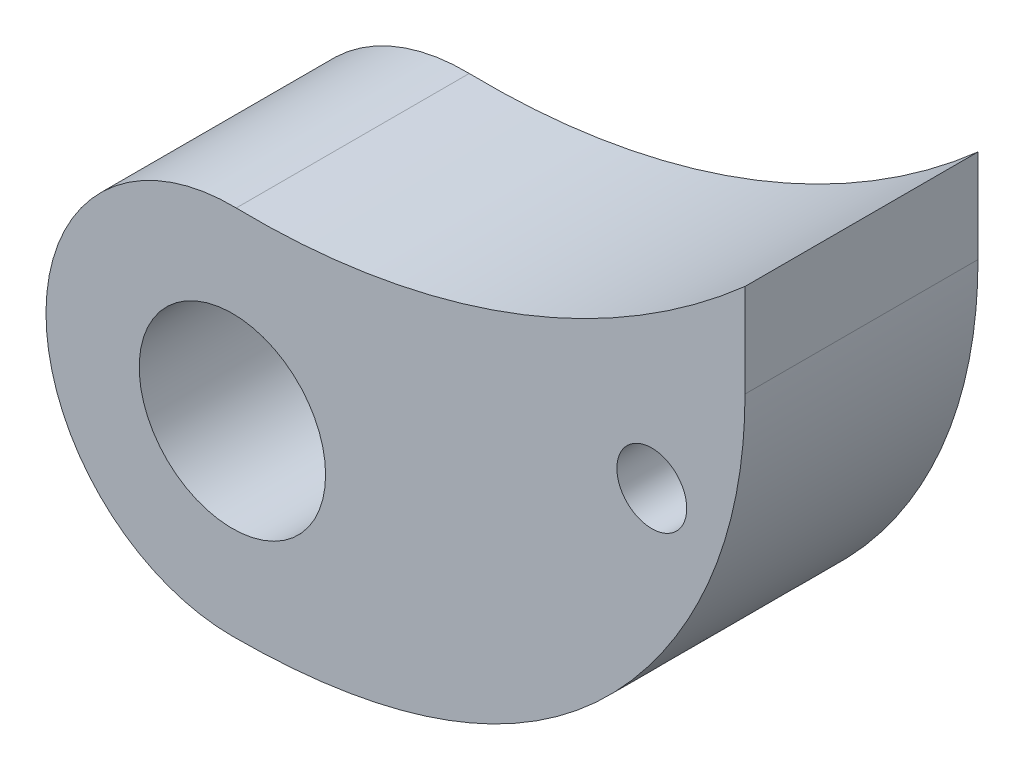
ISO-10303-21;
HEADER;
FILE_DESCRIPTION(('STEP AP214'),'2;1');
FILE_NAME('part.step','',(''),(''),'','','');
FILE_SCHEMA(('AUTOMOTIVE_DESIGN { 1 0 10303 214 1 1 1 1 }'));
ENDSEC;
DATA;
#1=APPLICATION_CONTEXT('core data for automotive mechanical design processes');
#2=APPLICATION_PROTOCOL_DEFINITION('international standard','automotive_design',2000,#1);
#3=PRODUCT_CONTEXT('',#1,'mechanical');
#4=PRODUCT('Part','Part','',(#3));
#5=PRODUCT_RELATED_PRODUCT_CATEGORY('part','',(#4));
#6=PRODUCT_DEFINITION_FORMATION('','',#4);
#7=PRODUCT_DEFINITION_CONTEXT('part definition',#1,'design');
#8=PRODUCT_DEFINITION('design','',#6,#7);
#9=PRODUCT_DEFINITION_SHAPE('','',#8);
#10=(LENGTH_UNIT() NAMED_UNIT(*) SI_UNIT(.MILLI.,.METRE.));
#11=(NAMED_UNIT(*) PLANE_ANGLE_UNIT() SI_UNIT($,.RADIAN.));
#12=(NAMED_UNIT(*) SI_UNIT($,.STERADIAN.) SOLID_ANGLE_UNIT());
#13=UNCERTAINTY_MEASURE_WITH_UNIT(LENGTH_MEASURE(1.E-05),#10,'distance_accuracy_value','');
#14=(GEOMETRIC_REPRESENTATION_CONTEXT(3) GLOBAL_UNCERTAINTY_ASSIGNED_CONTEXT((#13)) GLOBAL_UNIT_ASSIGNED_CONTEXT((#10,
#11,#12)) REPRESENTATION_CONTEXT('',''));
#15=CARTESIAN_POINT('',(0.,0.,0.));
#16=DIRECTION('',(0.,0.,1.));
#17=DIRECTION('',(1.,0.,0.));
#18=AXIS2_PLACEMENT_3D('',#15,#16,#17);
#19=CARTESIAN_POINT('',(0.412180191892476,19.9957522361478,-5.));
#20=DIRECTION('',(0.,0.,-1.));
#21=DIRECTION('',(1.,0.,0.));
#22=AXIS2_PLACEMENT_3D('',#19,#20,#21);
#23=PLANE('',#22);
#24=CARTESIAN_POINT('',(0.,0.,-5.));
#25=DIRECTION('',(0.,0.,1.));
#26=DIRECTION('',(1.,0.,0.));
#27=AXIS2_PLACEMENT_3D('',#24,#25,#26);
#28=CIRCLE('',#27,2.);
#29=CARTESIAN_POINT('',(2.,0.,-5.));
#30=VERTEX_POINT('',#29);
#31=EDGE_CURVE('E147',#30,#30,#28,.T.);
#32=ORIENTED_EDGE('',*,*,#31,.T.);
#33=EDGE_LOOP('',(#32));
#34=FACE_BOUND('',#33,.T.);
#35=CARTESIAN_POINT('',(0.412180191892476,19.9957522361478,-5.));
#36=DIRECTION('',(0.,0.,-1.));
#37=DIRECTION('',(1.,0.,0.));
#38=AXIS2_PLACEMENT_3D('',#35,#36,#37);
#39=CIRCLE('',#38,16.);
#40=CARTESIAN_POINT('',(11.,8.,-5.));
#41=VERTEX_POINT('',#40);
#42=CARTESIAN_POINT('',(0.0824360383784953,3.99915044722957,-5.));
#43=VERTEX_POINT('',#42);
#44=EDGE_CURVE('E93',#41,#43,#39,.T.);
#45=ORIENTED_EDGE('',*,*,#44,.F.);
#46=DIRECTION('',(0.,1.,0.));
#47=VECTOR('',#46,1.);
#48=CARTESIAN_POINT('',(11.,8.,-5.));
#49=LINE('',#48,#47);
#50=CARTESIAN_POINT('',(11.,6.,-5.));
#51=VERTEX_POINT('',#50);
#52=EDGE_CURVE('E96',#51,#41,#49,.T.);
#53=ORIENTED_EDGE('',*,*,#52,.F.);
#54=CARTESIAN_POINT('',(0.,-4.,-5.));
#55=CARTESIAN_POINT('',(4.2020349893536,-4.,-5.));
#56=CARTESIAN_POINT('',(8.98329257181985,-1.55655756657849,-5.));
#57=CARTESIAN_POINT('',(11.,3.64860659413861,-5.));
#58=CARTESIAN_POINT('',(11.,6.,-5.));
#59=B_SPLINE_CURVE_WITH_KNOTS('',3,(#54,#55,#56,#57,#58),.UNSPECIFIED.,.F.,.F.,(4,1,4),(0.,
0.608953578779127,1.),.UNSPECIFIED.);
#60=CARTESIAN_POINT('',(0.,-4.,-5.));
#61=VERTEX_POINT('',#60);
#62=EDGE_CURVE('E84',#61,#51,#59,.T.);
#63=ORIENTED_EDGE('',*,*,#62,.F.);
#64=CARTESIAN_POINT('',(0.,0.,-5.));
#65=DIRECTION('',(0.,0.,1.));
#66=DIRECTION('',(1.,0.,0.));
#67=AXIS2_PLACEMENT_3D('',#64,#65,#66);
#68=CIRCLE('',#67,4.);
#69=EDGE_CURVE('E89',#43,#61,#68,.T.);
#70=ORIENTED_EDGE('',*,*,#69,.F.);
#71=EDGE_LOOP('',(#45,#53,#63,#70));
#72=FACE_BOUND('',#71,.T.);
#73=CARTESIAN_POINT('',(9.,3.24788813764988,-5.));
#74=DIRECTION('',(0.,0.,1.));
#75=DIRECTION('',(1.,0.,0.));
#76=AXIS2_PLACEMENT_3D('',#73,#74,#75);
#77=CIRCLE('',#76,0.750000000000002);
#78=CARTESIAN_POINT('',(9.75,3.24788813764988,-5.));
#79=VERTEX_POINT('',#78);
#80=EDGE_CURVE('E138',#79,#79,#77,.T.);
#81=ORIENTED_EDGE('',*,*,#80,.T.);
#82=EDGE_LOOP('',(#81));
#83=FACE_BOUND('',#82,.T.);
#84=ADVANCED_FACE('F37',(#34,#72,#83),#23,.T.);
#85=CARTESIAN_POINT('',(0.412180191892476,19.9957522361478,0.));
#86=DIRECTION('',(0.,0.,-1.));
#87=DIRECTION('',(1.,0.,0.));
#88=AXIS2_PLACEMENT_3D('',#85,#86,#87);
#89=PLANE('',#88);
#90=CARTESIAN_POINT('',(0.412180191892476,19.9957522361478,0.));
#91=DIRECTION('',(0.,0.,-1.));
#92=DIRECTION('',(1.,0.,0.));
#93=AXIS2_PLACEMENT_3D('',#90,#91,#92);
#94=CIRCLE('',#93,16.);
#95=CARTESIAN_POINT('',(11.,8.,0.));
#96=VERTEX_POINT('',#95);
#97=CARTESIAN_POINT('',(0.0824360383784953,3.99915044722957,0.));
#98=VERTEX_POINT('',#97);
#99=EDGE_CURVE('E149',#96,#98,#94,.T.);
#100=ORIENTED_EDGE('',*,*,#99,.T.);
#101=CARTESIAN_POINT('',(0.,0.,0.));
#102=DIRECTION('',(0.,0.,1.));
#103=DIRECTION('',(1.,0.,0.));
#104=AXIS2_PLACEMENT_3D('',#101,#102,#103);
#105=CIRCLE('',#104,4.);
#106=CARTESIAN_POINT('',(0.,-4.,0.));
#107=VERTEX_POINT('',#106);
#108=EDGE_CURVE('E154',#98,#107,#105,.T.);
#109=ORIENTED_EDGE('',*,*,#108,.T.);
#110=CARTESIAN_POINT('',(0.,-4.,0.));
#111=CARTESIAN_POINT('',(4.2020349893536,-4.,0.));
#112=CARTESIAN_POINT('',(8.98329257181985,-1.55655756657849,0.));
#113=CARTESIAN_POINT('',(11.,3.64860659413861,0.));
#114=CARTESIAN_POINT('',(11.,6.,0.));
#115=B_SPLINE_CURVE_WITH_KNOTS('',3,(#110,#111,#112,#113,#114),.UNSPECIFIED.,.F.,.F.,(4,1,4),
(0.,0.608953578779127,1.),.UNSPECIFIED.);
#116=CARTESIAN_POINT('',(11.,6.,0.));
#117=VERTEX_POINT('',#116);
#118=EDGE_CURVE('E87',#107,#117,#115,.T.);
#119=ORIENTED_EDGE('',*,*,#118,.T.);
#120=DIRECTION('',(0.,1.,0.));
#121=VECTOR('',#120,1.);
#122=CARTESIAN_POINT('',(11.,8.,0.));
#123=LINE('',#122,#121);
#124=EDGE_CURVE('E151',#117,#96,#123,.T.);
#125=ORIENTED_EDGE('',*,*,#124,.T.);
#126=EDGE_LOOP('',(#100,#109,#119,#125));
#127=FACE_BOUND('',#126,.T.);
#128=CARTESIAN_POINT('',(0.,0.,0.));
#129=DIRECTION('',(0.,0.,1.));
#130=DIRECTION('',(1.,0.,0.));
#131=AXIS2_PLACEMENT_3D('',#128,#129,#130);
#132=CIRCLE('',#131,2.);
#133=CARTESIAN_POINT('',(2.,0.,0.));
#134=VERTEX_POINT('',#133);
#135=EDGE_CURVE('E144',#134,#134,#132,.T.);
#136=ORIENTED_EDGE('',*,*,#135,.F.);
#137=EDGE_LOOP('',(#136));
#138=FACE_BOUND('',#137,.T.);
#139=CARTESIAN_POINT('',(9.,3.24788813764988,0.));
#140=DIRECTION('',(0.,0.,1.));
#141=DIRECTION('',(1.,0.,0.));
#142=AXIS2_PLACEMENT_3D('',#139,#140,#141);
#143=CIRCLE('',#142,0.750000000000002);
#144=CARTESIAN_POINT('',(9.75,3.24788813764988,0.));
#145=VERTEX_POINT('',#144);
#146=EDGE_CURVE('E141',#145,#145,#143,.T.);
#147=ORIENTED_EDGE('',*,*,#146,.F.);
#148=EDGE_LOOP('',(#147));
#149=FACE_BOUND('',#148,.T.);
#150=ADVANCED_FACE('F116',(#127,#138,#149),#89,.F.);
#151=CARTESIAN_POINT('',(0.412180191892476,19.9957522361478,-5.));
#152=DIRECTION('',(0.,0.,1.));
#153=DIRECTION('',(-1.,0.,0.));
#154=AXIS2_PLACEMENT_3D('',#151,#152,#153);
#155=CYLINDRICAL_SURFACE('',#154,16.);
#156=ORIENTED_EDGE('',*,*,#99,.F.);
#157=DIRECTION('',(0.,0.,1.));
#158=VECTOR('',#157,1.);
#159=CARTESIAN_POINT('',(11.,8.,-5.));
#160=LINE('',#159,#158);
#161=EDGE_CURVE('E54',#41,#96,#160,.T.);
#162=ORIENTED_EDGE('',*,*,#161,.F.);
#163=ORIENTED_EDGE('',*,*,#44,.T.);
#164=DIRECTION('',(0.,0.,1.));
#165=VECTOR('',#164,1.);
#166=CARTESIAN_POINT('',(0.0824360383784953,3.99915044722957,-5.));
#167=LINE('',#166,#165);
#168=EDGE_CURVE('E11',#43,#98,#167,.T.);
#169=ORIENTED_EDGE('',*,*,#168,.T.);
#170=EDGE_LOOP('',(#156,#162,#163,#169));
#171=FACE_BOUND('',#170,.T.);
#172=ADVANCED_FACE('F39',(#171),#155,.F.);
#173=CARTESIAN_POINT('',(0.,0.,-5.));
#174=DIRECTION('',(0.,0.,1.));
#175=DIRECTION('',(-1.,0.,0.));
#176=AXIS2_PLACEMENT_3D('',#173,#174,#175);
#177=CYLINDRICAL_SURFACE('',#176,4.);
#178=ORIENTED_EDGE('',*,*,#108,.F.);
#179=ORIENTED_EDGE('',*,*,#168,.F.);
#180=ORIENTED_EDGE('',*,*,#69,.T.);
#181=DIRECTION('',(0.,0.,1.));
#182=VECTOR('',#181,1.);
#183=CARTESIAN_POINT('',(0.,-4.,-5.));
#184=LINE('',#183,#182);
#185=EDGE_CURVE('E46',#61,#107,#184,.T.);
#186=ORIENTED_EDGE('',*,*,#185,.T.);
#187=EDGE_LOOP('',(#178,#179,#180,#186));
#188=FACE_BOUND('',#187,.T.);
#189=ADVANCED_FACE('F90',(#188),#177,.T.);
#190=DIRECTION('',(0.,0.,1.));
#191=VECTOR('',#190,1.);
#192=SURFACE_OF_LINEAR_EXTRUSION('',#59,#191);
#193=ORIENTED_EDGE('',*,*,#118,.F.);
#194=ORIENTED_EDGE('',*,*,#185,.F.);
#195=ORIENTED_EDGE('',*,*,#62,.T.);
#196=DIRECTION('',(0.,0.,1.));
#197=VECTOR('',#196,1.);
#198=CARTESIAN_POINT('',(11.,6.,-5.));
#199=LINE('',#198,#197);
#200=EDGE_CURVE('E70',#51,#117,#199,.T.);
#201=ORIENTED_EDGE('',*,*,#200,.T.);
#202=EDGE_LOOP('',(#193,#194,#195,#201));
#203=FACE_BOUND('',#202,.T.);
#204=ADVANCED_FACE('F82',(#203),#192,.T.);
#205=CARTESIAN_POINT('',(11.,8.,-5.));
#206=DIRECTION('',(-1.,0.,0.));
#207=DIRECTION('',(0.,-1.,0.));
#208=AXIS2_PLACEMENT_3D('',#205,#206,#207);
#209=PLANE('',#208);
#210=ORIENTED_EDGE('',*,*,#124,.F.);
#211=ORIENTED_EDGE('',*,*,#200,.F.);
#212=ORIENTED_EDGE('',*,*,#52,.T.);
#213=ORIENTED_EDGE('',*,*,#161,.T.);
#214=EDGE_LOOP('',(#210,#211,#212,#213));
#215=FACE_BOUND('',#214,.T.);
#216=ADVANCED_FACE('F110',(#215),#209,.F.);
#217=CARTESIAN_POINT('',(0.,0.,-5.));
#218=DIRECTION('',(0.,0.,1.));
#219=DIRECTION('',(-1.,0.,0.));
#220=AXIS2_PLACEMENT_3D('',#217,#218,#219);
#221=CYLINDRICAL_SURFACE('',#220,2.);
#222=ORIENTED_EDGE('',*,*,#31,.F.);
#223=EDGE_LOOP('',(#222));
#224=FACE_BOUND('',#223,.T.);
#225=ORIENTED_EDGE('',*,*,#135,.T.);
#226=EDGE_LOOP('',(#225));
#227=FACE_BOUND('',#226,.T.);
#228=ADVANCED_FACE('F126',(#224,#227),#221,.F.);
#229=CARTESIAN_POINT('',(9.,3.24788813764988,-5.));
#230=DIRECTION('',(0.,0.,1.));
#231=DIRECTION('',(-1.,0.,0.));
#232=AXIS2_PLACEMENT_3D('',#229,#230,#231);
#233=CYLINDRICAL_SURFACE('',#232,0.750000000000002);
#234=ORIENTED_EDGE('',*,*,#80,.F.);
#235=EDGE_LOOP('',(#234));
#236=FACE_BOUND('',#235,.T.);
#237=ORIENTED_EDGE('',*,*,#146,.T.);
#238=EDGE_LOOP('',(#237));
#239=FACE_BOUND('',#238,.T.);
#240=ADVANCED_FACE('F129',(#236,#239),#233,.F.);
#241=CLOSED_SHELL('',(#84,#150,#172,#189,#204,#216,#228,#240));
#242=MANIFOLD_SOLID_BREP('B2',#241);
#243=ADVANCED_BREP_SHAPE_REPRESENTATION('',(#18,#242),#14);
#244=SHAPE_DEFINITION_REPRESENTATION(#9,#243);
ENDSEC;
END-ISO-10303-21;
